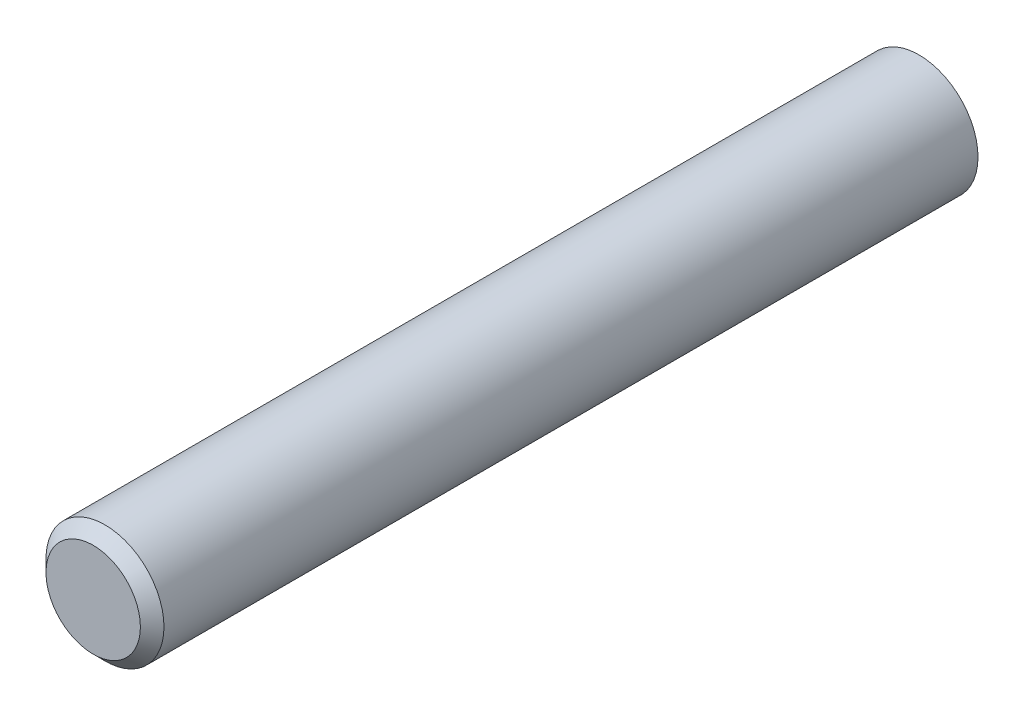
ISO-10303-21;
HEADER;
FILE_DESCRIPTION(('STEP AP214'),'2;1');
FILE_NAME('part.step','',(''),(''),'','','');
FILE_SCHEMA(('AUTOMOTIVE_DESIGN { 1 0 10303 214 1 1 1 1 }'));
ENDSEC;
DATA;
#1=APPLICATION_CONTEXT('core data for automotive mechanical design processes');
#2=APPLICATION_PROTOCOL_DEFINITION('international standard','automotive_design',2000,#1);
#3=PRODUCT_CONTEXT('',#1,'mechanical');
#4=PRODUCT('Part','Part','',(#3));
#5=PRODUCT_RELATED_PRODUCT_CATEGORY('part','',(#4));
#6=PRODUCT_DEFINITION_FORMATION('','',#4);
#7=PRODUCT_DEFINITION_CONTEXT('part definition',#1,'design');
#8=PRODUCT_DEFINITION('design','',#6,#7);
#9=PRODUCT_DEFINITION_SHAPE('','',#8);
#10=(LENGTH_UNIT() NAMED_UNIT(*) SI_UNIT(.MILLI.,.METRE.));
#11=(NAMED_UNIT(*) PLANE_ANGLE_UNIT() SI_UNIT($,.RADIAN.));
#12=(NAMED_UNIT(*) SI_UNIT($,.STERADIAN.) SOLID_ANGLE_UNIT());
#13=UNCERTAINTY_MEASURE_WITH_UNIT(LENGTH_MEASURE(1.E-05),#10,'distance_accuracy_value','');
#14=(GEOMETRIC_REPRESENTATION_CONTEXT(3) GLOBAL_UNCERTAINTY_ASSIGNED_CONTEXT((#13)) GLOBAL_UNIT_ASSIGNED_CONTEXT((#10,
#11,#12)) REPRESENTATION_CONTEXT('',''));
#15=CARTESIAN_POINT('',(0.,0.,0.));
#16=DIRECTION('',(0.,0.,1.));
#17=DIRECTION('',(1.,0.,0.));
#18=AXIS2_PLACEMENT_3D('',#15,#16,#17);
#19=CARTESIAN_POINT('',(0.,0.,70.));
#20=DIRECTION('',(0.,0.,-1.));
#21=DIRECTION('',(-1.,0.,0.));
#22=AXIS2_PLACEMENT_3D('',#19,#20,#21);
#23=CYLINDRICAL_SURFACE('',#22,5.);
#24=CARTESIAN_POINT('',(0.,0.,69.));
#25=DIRECTION('',(0.,0.,1.));
#26=DIRECTION('',(1.,0.,0.));
#27=AXIS2_PLACEMENT_3D('',#24,#25,#26);
#28=CIRCLE('',#27,5.);
#29=CARTESIAN_POINT('',(5.,0.,69.));
#30=VERTEX_POINT('',#29);
#31=EDGE_CURVE('E10',#30,#30,#28,.F.);
#32=ORIENTED_EDGE('',*,*,#31,.T.);
#33=EDGE_LOOP('',(#32));
#34=FACE_BOUND('',#33,.T.);
#35=CARTESIAN_POINT('',(0.,0.,0.));
#36=DIRECTION('',(0.,0.,1.));
#37=DIRECTION('',(1.,0.,0.));
#38=AXIS2_PLACEMENT_3D('',#35,#36,#37);
#39=CIRCLE('',#38,5.);
#40=CARTESIAN_POINT('',(5.,0.,0.));
#41=VERTEX_POINT('',#40);
#42=EDGE_CURVE('E42',#41,#41,#39,.T.);
#43=ORIENTED_EDGE('',*,*,#42,.T.);
#44=EDGE_LOOP('',(#43));
#45=FACE_BOUND('',#44,.T.);
#46=ADVANCED_FACE('F31',(#34,#45),#23,.T.);
#47=CARTESIAN_POINT('',(0.,0.,70.));
#48=DIRECTION('',(0.,0.,1.));
#49=DIRECTION('',(1.,0.,0.));
#50=AXIS2_PLACEMENT_3D('',#47,#48,#49);
#51=PLANE('',#50);
#52=CARTESIAN_POINT('',(0.,0.,70.));
#53=DIRECTION('',(0.,0.,1.));
#54=DIRECTION('',(1.,0.,0.));
#55=AXIS2_PLACEMENT_3D('',#52,#53,#54);
#56=CIRCLE('',#55,4.00000000000002);
#57=CARTESIAN_POINT('',(4.00000000000002,0.,70.));
#58=VERTEX_POINT('',#57);
#59=EDGE_CURVE('E38',#58,#58,#56,.T.);
#60=ORIENTED_EDGE('',*,*,#59,.T.);
#61=EDGE_LOOP('',(#60));
#62=FACE_BOUND('',#61,.T.);
#63=ADVANCED_FACE('F52',(#62),#51,.T.);
#64=CARTESIAN_POINT('',(0.,0.,0.));
#65=DIRECTION('',(0.,0.,1.));
#66=DIRECTION('',(1.,0.,0.));
#67=AXIS2_PLACEMENT_3D('',#64,#65,#66);
#68=PLANE('',#67);
#69=ORIENTED_EDGE('',*,*,#42,.F.);
#70=EDGE_LOOP('',(#69));
#71=FACE_BOUND('',#70,.T.);
#72=ADVANCED_FACE('F50',(#71),#68,.F.);
#73=CARTESIAN_POINT('',(0.,0.,70.));
#74=DIRECTION('',(0.,0.,-1.));
#75=DIRECTION('',(-1.,0.,0.));
#76=AXIS2_PLACEMENT_3D('',#73,#74,#75);
#77=CONICAL_SURFACE('',#76,4.00000000000002,0.785398163397447);
#78=ORIENTED_EDGE('',*,*,#31,.F.);
#79=EDGE_LOOP('',(#78));
#80=FACE_BOUND('',#79,.T.);
#81=ORIENTED_EDGE('',*,*,#59,.F.);
#82=EDGE_LOOP('',(#81));
#83=FACE_BOUND('',#82,.T.);
#84=ADVANCED_FACE('F33',(#80,#83),#77,.T.);
#85=CLOSED_SHELL('',(#46,#63,#72,#84));
#86=MANIFOLD_SOLID_BREP('B2',#85);
#87=ADVANCED_BREP_SHAPE_REPRESENTATION('',(#18,#86),#14);
#88=SHAPE_DEFINITION_REPRESENTATION(#9,#87);
ENDSEC;
END-ISO-10303-21;
